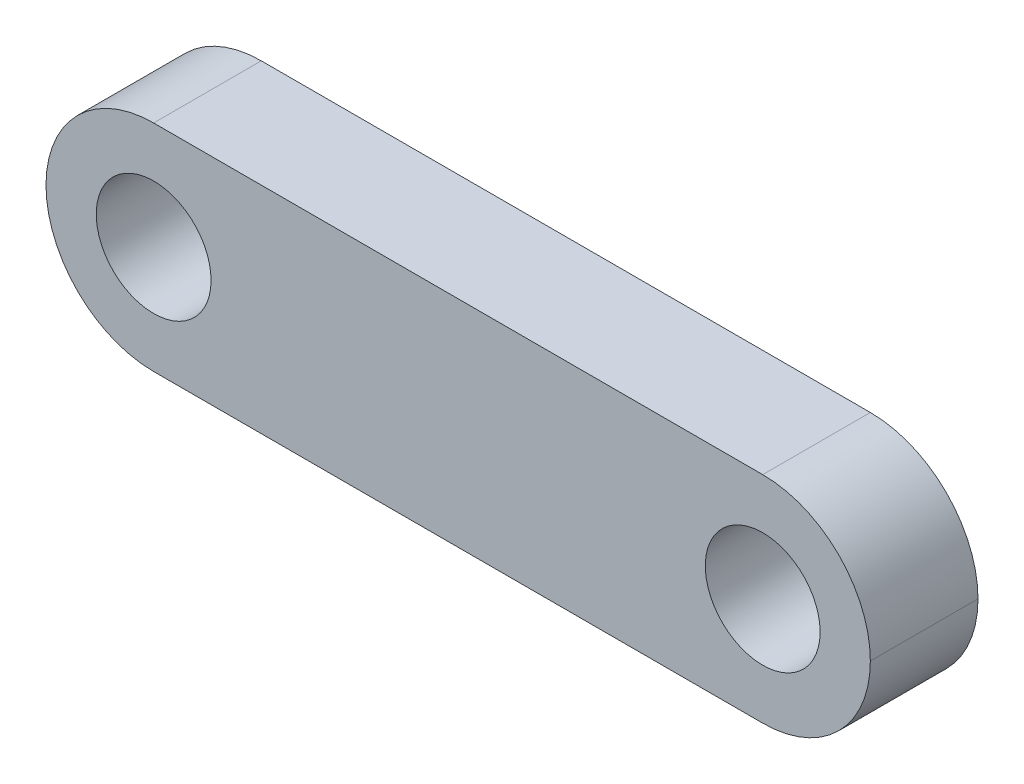
ISO-10303-21;
HEADER;
FILE_DESCRIPTION(('STEP AP214'),'2;1');
FILE_NAME('part.step','',(''),(''),'','','');
FILE_SCHEMA(('AUTOMOTIVE_DESIGN { 1 0 10303 214 1 1 1 1 }'));
ENDSEC;
DATA;
#1=APPLICATION_CONTEXT('core data for automotive mechanical design processes');
#2=APPLICATION_PROTOCOL_DEFINITION('international standard','automotive_design',2000,#1);
#3=PRODUCT_CONTEXT('',#1,'mechanical');
#4=PRODUCT('Part','Part','',(#3));
#5=PRODUCT_RELATED_PRODUCT_CATEGORY('part','',(#4));
#6=PRODUCT_DEFINITION_FORMATION('','',#4);
#7=PRODUCT_DEFINITION_CONTEXT('part definition',#1,'design');
#8=PRODUCT_DEFINITION('design','',#6,#7);
#9=PRODUCT_DEFINITION_SHAPE('','',#8);
#10=(LENGTH_UNIT() NAMED_UNIT(*) SI_UNIT(.MILLI.,.METRE.));
#11=(NAMED_UNIT(*) PLANE_ANGLE_UNIT() SI_UNIT($,.RADIAN.));
#12=(NAMED_UNIT(*) SI_UNIT($,.STERADIAN.) SOLID_ANGLE_UNIT());
#13=UNCERTAINTY_MEASURE_WITH_UNIT(LENGTH_MEASURE(1.E-05),#10,'distance_accuracy_value','');
#14=(GEOMETRIC_REPRESENTATION_CONTEXT(3) GLOBAL_UNCERTAINTY_ASSIGNED_CONTEXT((#13)) GLOBAL_UNIT_ASSIGNED_CONTEXT((#10,
#11,#12)) REPRESENTATION_CONTEXT('',''));
#15=CARTESIAN_POINT('',(0.,0.,0.));
#16=DIRECTION('',(0.,0.,1.));
#17=DIRECTION('',(1.,0.,0.));
#18=AXIS2_PLACEMENT_3D('',#15,#16,#17);
#19=CARTESIAN_POINT('',(7.77408782256623,3.,0.));
#20=DIRECTION('',(0.,0.,1.));
#21=DIRECTION('',(1.,0.,0.));
#22=AXIS2_PLACEMENT_3D('',#19,#20,#21);
#23=CYLINDRICAL_SURFACE('',#22,3.);
#24=CARTESIAN_POINT('',(7.77408782256623,3.,3.));
#25=DIRECTION('',(0.,0.,1.));
#26=DIRECTION('',(1.,0.,0.));
#27=AXIS2_PLACEMENT_3D('',#24,#25,#26);
#28=CIRCLE('',#27,3.);
#29=CARTESIAN_POINT('',(7.77408782256623,0.,3.));
#30=VERTEX_POINT('',#29);
#31=CARTESIAN_POINT('',(10.7740878225662,2.99999999999813,3.));
#32=VERTEX_POINT('',#31);
#33=EDGE_CURVE('E130',#30,#32,#28,.T.);
#34=ORIENTED_EDGE('',*,*,#33,.F.);
#35=DIRECTION('',(0.,0.,1.));
#36=VECTOR('',#35,1.);
#37=CARTESIAN_POINT('',(7.77408782256623,0.,0.));
#38=LINE('',#37,#36);
#39=CARTESIAN_POINT('',(7.77408782256623,0.,0.));
#40=VERTEX_POINT('',#39);
#41=EDGE_CURVE('E11',#40,#30,#38,.T.);
#42=ORIENTED_EDGE('',*,*,#41,.F.);
#43=CARTESIAN_POINT('',(7.77408782256623,3.,0.));
#44=DIRECTION('',(0.,0.,1.));
#45=DIRECTION('',(1.,0.,0.));
#46=AXIS2_PLACEMENT_3D('',#43,#44,#45);
#47=CIRCLE('',#46,3.);
#48=CARTESIAN_POINT('',(10.7740878225662,2.99999999999813,0.));
#49=VERTEX_POINT('',#48);
#50=EDGE_CURVE('E151',#40,#49,#47,.T.);
#51=ORIENTED_EDGE('',*,*,#50,.T.);
#52=DIRECTION('',(0.,0.,1.));
#53=VECTOR('',#52,1.);
#54=CARTESIAN_POINT('',(10.7740878225662,2.99999999999813,0.));
#55=LINE('',#54,#53);
#56=EDGE_CURVE('E42',#49,#32,#55,.T.);
#57=ORIENTED_EDGE('',*,*,#56,.T.);
#58=EDGE_LOOP('',(#34,#42,#51,#57));
#59=FACE_BOUND('',#58,.T.);
#60=ADVANCED_FACE('F39',(#59),#23,.T.);
#61=CARTESIAN_POINT('',(-9.20014533111081,0.,0.));
#62=DIRECTION('',(0.,-1.,0.));
#63=DIRECTION('',(0.,0.,-1.));
#64=AXIS2_PLACEMENT_3D('',#61,#62,#63);
#65=PLANE('',#64);
#66=DIRECTION('',(1.,0.,0.));
#67=VECTOR('',#66,1.);
#68=CARTESIAN_POINT('',(-9.20014533111081,0.,3.));
#69=LINE('',#68,#67);
#70=CARTESIAN_POINT('',(-9.20014533111081,0.,3.));
#71=VERTEX_POINT('',#70);
#72=EDGE_CURVE('E148',#71,#30,#69,.T.);
#73=ORIENTED_EDGE('',*,*,#72,.F.);
#74=DIRECTION('',(0.,0.,1.));
#75=VECTOR('',#74,1.);
#76=CARTESIAN_POINT('',(-9.20014533111081,0.,0.));
#77=LINE('',#76,#75);
#78=CARTESIAN_POINT('',(-9.20014533111081,0.,0.));
#79=VERTEX_POINT('',#78);
#80=EDGE_CURVE('E49',#79,#71,#77,.T.);
#81=ORIENTED_EDGE('',*,*,#80,.F.);
#82=DIRECTION('',(1.,0.,0.));
#83=VECTOR('',#82,1.);
#84=CARTESIAN_POINT('',(-9.20014533111081,0.,0.));
#85=LINE('',#84,#83);
#86=EDGE_CURVE('E116',#79,#40,#85,.T.);
#87=ORIENTED_EDGE('',*,*,#86,.T.);
#88=ORIENTED_EDGE('',*,*,#41,.T.);
#89=EDGE_LOOP('',(#73,#81,#87,#88));
#90=FACE_BOUND('',#89,.T.);
#91=ADVANCED_FACE('F163',(#90),#65,.T.);
#92=CARTESIAN_POINT('',(-9.20014533111081,3.,0.));
#93=DIRECTION('',(0.,0.,1.));
#94=DIRECTION('',(1.,0.,0.));
#95=AXIS2_PLACEMENT_3D('',#92,#93,#94);
#96=CYLINDRICAL_SURFACE('',#95,3.);
#97=CARTESIAN_POINT('',(-9.20014533111081,3.,3.));
#98=DIRECTION('',(0.,0.,1.));
#99=DIRECTION('',(1.,0.,0.));
#100=AXIS2_PLACEMENT_3D('',#97,#98,#99);
#101=CIRCLE('',#100,3.);
#102=CARTESIAN_POINT('',(-12.2001451644441,2.99899999999927,3.));
#103=VERTEX_POINT('',#102);
#104=EDGE_CURVE('E102',#103,#71,#101,.T.);
#105=ORIENTED_EDGE('',*,*,#104,.F.);
#106=DIRECTION('',(0.,0.,1.));
#107=VECTOR('',#106,1.);
#108=CARTESIAN_POINT('',(-12.2001451644441,2.99899999999927,0.));
#109=LINE('',#108,#107);
#110=CARTESIAN_POINT('',(-12.2001451644441,2.99899999999927,0.));
#111=VERTEX_POINT('',#110);
#112=EDGE_CURVE('E97',#111,#103,#109,.T.);
#113=ORIENTED_EDGE('',*,*,#112,.F.);
#114=CARTESIAN_POINT('',(-9.20014533111081,3.,0.));
#115=DIRECTION('',(0.,0.,1.));
#116=DIRECTION('',(1.,0.,0.));
#117=AXIS2_PLACEMENT_3D('',#114,#115,#116);
#118=CIRCLE('',#117,3.);
#119=EDGE_CURVE('E100',#111,#79,#118,.T.);
#120=ORIENTED_EDGE('',*,*,#119,.T.);
#121=ORIENTED_EDGE('',*,*,#80,.T.);
#122=EDGE_LOOP('',(#105,#113,#120,#121));
#123=FACE_BOUND('',#122,.T.);
#124=ADVANCED_FACE('F99',(#123),#96,.T.);
#125=CARTESIAN_POINT('',(-9.20014516444414,2.999,0.));
#126=DIRECTION('',(0.,0.,1.));
#127=DIRECTION('',(1.,0.,0.));
#128=AXIS2_PLACEMENT_3D('',#125,#126,#127);
#129=CYLINDRICAL_SURFACE('',#128,3.);
#130=CARTESIAN_POINT('',(-9.20014516444414,2.999,3.));
#131=DIRECTION('',(0.,0.,1.));
#132=DIRECTION('',(1.,0.,0.));
#133=AXIS2_PLACEMENT_3D('',#130,#131,#132);
#134=CIRCLE('',#133,3.);
#135=CARTESIAN_POINT('',(-9.20014516444414,5.999,3.));
#136=VERTEX_POINT('',#135);
#137=EDGE_CURVE('E143',#136,#103,#134,.T.);
#138=ORIENTED_EDGE('',*,*,#137,.F.);
#139=DIRECTION('',(0.,0.,1.));
#140=VECTOR('',#139,1.);
#141=CARTESIAN_POINT('',(-9.20014516444414,5.999,0.));
#142=LINE('',#141,#140);
#143=CARTESIAN_POINT('',(-9.20014516444414,5.999,0.));
#144=VERTEX_POINT('',#143);
#145=EDGE_CURVE('E108',#144,#136,#142,.T.);
#146=ORIENTED_EDGE('',*,*,#145,.F.);
#147=CARTESIAN_POINT('',(-9.20014516444414,2.999,0.));
#148=DIRECTION('',(0.,0.,1.));
#149=DIRECTION('',(1.,0.,0.));
#150=AXIS2_PLACEMENT_3D('',#147,#148,#149);
#151=CIRCLE('',#150,3.);
#152=EDGE_CURVE('E114',#144,#111,#151,.T.);
#153=ORIENTED_EDGE('',*,*,#152,.T.);
#154=ORIENTED_EDGE('',*,*,#112,.T.);
#155=EDGE_LOOP('',(#138,#146,#153,#154));
#156=FACE_BOUND('',#155,.T.);
#157=ADVANCED_FACE('F119',(#156),#129,.T.);
#158=CARTESIAN_POINT('',(7.7740879892329,5.999,0.));
#159=DIRECTION('',(0.,1.,0.));
#160=DIRECTION('',(-1.,0.,0.));
#161=AXIS2_PLACEMENT_3D('',#158,#159,#160);
#162=PLANE('',#161);
#163=DIRECTION('',(-1.,0.,0.));
#164=VECTOR('',#163,1.);
#165=CARTESIAN_POINT('',(7.7740879892329,5.999,3.));
#166=LINE('',#165,#164);
#167=CARTESIAN_POINT('',(7.7740879892329,5.999,3.));
#168=VERTEX_POINT('',#167);
#169=EDGE_CURVE('E139',#168,#136,#166,.T.);
#170=ORIENTED_EDGE('',*,*,#169,.F.);
#171=DIRECTION('',(0.,0.,1.));
#172=VECTOR('',#171,1.);
#173=CARTESIAN_POINT('',(7.7740879892329,5.999,0.));
#174=LINE('',#173,#172);
#175=CARTESIAN_POINT('',(7.7740879892329,5.999,0.));
#176=VERTEX_POINT('',#175);
#177=EDGE_CURVE('E156',#176,#168,#174,.T.);
#178=ORIENTED_EDGE('',*,*,#177,.F.);
#179=DIRECTION('',(-1.,0.,0.));
#180=VECTOR('',#179,1.);
#181=CARTESIAN_POINT('',(7.7740879892329,5.999,0.));
#182=LINE('',#181,#180);
#183=EDGE_CURVE('E121',#176,#144,#182,.T.);
#184=ORIENTED_EDGE('',*,*,#183,.T.);
#185=ORIENTED_EDGE('',*,*,#145,.T.);
#186=EDGE_LOOP('',(#170,#178,#184,#185));
#187=FACE_BOUND('',#186,.T.);
#188=ADVANCED_FACE('F176',(#187),#162,.T.);
#189=CARTESIAN_POINT('',(7.7740879892329,2.999,0.));
#190=DIRECTION('',(0.,0.,1.));
#191=DIRECTION('',(1.,0.,0.));
#192=AXIS2_PLACEMENT_3D('',#189,#190,#191);
#193=CYLINDRICAL_SURFACE('',#192,3.);
#194=CARTESIAN_POINT('',(7.7740879892329,2.999,3.));
#195=DIRECTION('',(0.,0.,1.));
#196=DIRECTION('',(1.,0.,0.));
#197=AXIS2_PLACEMENT_3D('',#194,#195,#196);
#198=CIRCLE('',#197,3.);
#199=EDGE_CURVE('E134',#32,#168,#198,.T.);
#200=ORIENTED_EDGE('',*,*,#199,.F.);
#201=ORIENTED_EDGE('',*,*,#56,.F.);
#202=CARTESIAN_POINT('',(7.7740879892329,2.999,0.));
#203=DIRECTION('',(0.,0.,1.));
#204=DIRECTION('',(1.,0.,0.));
#205=AXIS2_PLACEMENT_3D('',#202,#203,#204);
#206=CIRCLE('',#205,3.);
#207=EDGE_CURVE('E124',#49,#176,#206,.T.);
#208=ORIENTED_EDGE('',*,*,#207,.T.);
#209=ORIENTED_EDGE('',*,*,#177,.T.);
#210=EDGE_LOOP('',(#200,#201,#208,#209));
#211=FACE_BOUND('',#210,.T.);
#212=ADVANCED_FACE('F160',(#211),#193,.T.);
#213=CARTESIAN_POINT('',(7.77408782256623,3.,0.));
#214=DIRECTION('',(0.,0.,1.));
#215=DIRECTION('',(1.,0.,0.));
#216=AXIS2_PLACEMENT_3D('',#213,#214,#215);
#217=PLANE('',#216);
#218=CARTESIAN_POINT('',(-9.20014533111081,3.,0.));
#219=DIRECTION('',(0.,0.,1.));
#220=DIRECTION('',(1.,0.,0.));
#221=AXIS2_PLACEMENT_3D('',#218,#219,#220);
#222=CIRCLE('',#221,1.6);
#223=CARTESIAN_POINT('',(-7.60014533111081,3.,0.));
#224=VERTEX_POINT('',#223);
#225=EDGE_CURVE('E135',#224,#224,#222,.T.);
#226=ORIENTED_EDGE('',*,*,#225,.T.);
#227=EDGE_LOOP('',(#226));
#228=FACE_BOUND('',#227,.T.);
#229=CARTESIAN_POINT('',(7.7740879892329,2.999,0.));
#230=DIRECTION('',(0.,0.,1.));
#231=DIRECTION('',(1.,0.,0.));
#232=AXIS2_PLACEMENT_3D('',#229,#230,#231);
#233=CIRCLE('',#232,1.6);
#234=CARTESIAN_POINT('',(9.3740879892329,2.999,0.));
#235=VERTEX_POINT('',#234);
#236=EDGE_CURVE('E206',#235,#235,#233,.T.);
#237=ORIENTED_EDGE('',*,*,#236,.T.);
#238=EDGE_LOOP('',(#237));
#239=FACE_BOUND('',#238,.T.);
#240=ORIENTED_EDGE('',*,*,#50,.F.);
#241=ORIENTED_EDGE('',*,*,#86,.F.);
#242=ORIENTED_EDGE('',*,*,#119,.F.);
#243=ORIENTED_EDGE('',*,*,#152,.F.);
#244=ORIENTED_EDGE('',*,*,#183,.F.);
#245=ORIENTED_EDGE('',*,*,#207,.F.);
#246=EDGE_LOOP('',(#240,#241,#242,#243,#244,#245));
#247=FACE_BOUND('',#246,.T.);
#248=ADVANCED_FACE('F112',(#228,#239,#247),#217,.F.);
#249=CARTESIAN_POINT('',(7.77408782256623,3.,3.));
#250=DIRECTION('',(0.,0.,1.));
#251=DIRECTION('',(1.,0.,0.));
#252=AXIS2_PLACEMENT_3D('',#249,#250,#251);
#253=PLANE('',#252);
#254=CARTESIAN_POINT('',(-9.20014533111081,3.,3.));
#255=DIRECTION('',(0.,0.,1.));
#256=DIRECTION('',(1.,0.,0.));
#257=AXIS2_PLACEMENT_3D('',#254,#255,#256);
#258=CIRCLE('',#257,1.6);
#259=CARTESIAN_POINT('',(-7.60014533111081,3.,3.));
#260=VERTEX_POINT('',#259);
#261=EDGE_CURVE('E204',#260,#260,#258,.T.);
#262=ORIENTED_EDGE('',*,*,#261,.F.);
#263=EDGE_LOOP('',(#262));
#264=FACE_BOUND('',#263,.T.);
#265=CARTESIAN_POINT('',(7.7740879892329,2.999,3.));
#266=DIRECTION('',(0.,0.,1.));
#267=DIRECTION('',(1.,0.,0.));
#268=AXIS2_PLACEMENT_3D('',#265,#266,#267);
#269=CIRCLE('',#268,1.6);
#270=CARTESIAN_POINT('',(9.3740879892329,2.999,3.));
#271=VERTEX_POINT('',#270);
#272=EDGE_CURVE('E212',#271,#271,#269,.T.);
#273=ORIENTED_EDGE('',*,*,#272,.F.);
#274=EDGE_LOOP('',(#273));
#275=FACE_BOUND('',#274,.T.);
#276=ORIENTED_EDGE('',*,*,#33,.T.);
#277=ORIENTED_EDGE('',*,*,#199,.T.);
#278=ORIENTED_EDGE('',*,*,#169,.T.);
#279=ORIENTED_EDGE('',*,*,#137,.T.);
#280=ORIENTED_EDGE('',*,*,#104,.T.);
#281=ORIENTED_EDGE('',*,*,#72,.T.);
#282=EDGE_LOOP('',(#276,#277,#278,#279,#280,#281));
#283=FACE_BOUND('',#282,.T.);
#284=ADVANCED_FACE('F162',(#264,#275,#283),#253,.T.);
#285=CARTESIAN_POINT('',(7.7740879892329,2.999,0.));
#286=DIRECTION('',(0.,0.,1.));
#287=DIRECTION('',(1.,0.,0.));
#288=AXIS2_PLACEMENT_3D('',#285,#286,#287);
#289=CYLINDRICAL_SURFACE('',#288,1.6);
#290=CARTESIAN_POINT('',(9.3740879892329,2.999,0.));
#291=CARTESIAN_POINT('',(9.3740879892329,2.999,0.0312499999999995));
#292=CARTESIAN_POINT('',(9.3740879892329,2.999,0.0624999999999996));
#293=CARTESIAN_POINT('',(9.3740879892329,2.999,0.125));
#294=CARTESIAN_POINT('',(9.3740879892329,2.999,0.15625));
#295=CARTESIAN_POINT('',(9.3740879892329,2.999,0.21875));
#296=CARTESIAN_POINT('',(9.3740879892329,2.999,0.25));
#297=CARTESIAN_POINT('',(9.3740879892329,2.999,0.3125));
#298=CARTESIAN_POINT('',(9.3740879892329,2.999,0.34375));
#299=CARTESIAN_POINT('',(9.3740879892329,2.999,0.40625));
#300=CARTESIAN_POINT('',(9.3740879892329,2.999,0.4375));
#301=CARTESIAN_POINT('',(9.3740879892329,2.999,0.5));
#302=CARTESIAN_POINT('',(9.3740879892329,2.999,0.53125));
#303=CARTESIAN_POINT('',(9.3740879892329,2.999,0.59375));
#304=CARTESIAN_POINT('',(9.3740879892329,2.999,0.625));
#305=CARTESIAN_POINT('',(9.3740879892329,2.999,0.6875));
#306=CARTESIAN_POINT('',(9.3740879892329,2.999,0.71875));
#307=CARTESIAN_POINT('',(9.3740879892329,2.999,0.78125));
#308=CARTESIAN_POINT('',(9.3740879892329,2.999,0.8125));
#309=CARTESIAN_POINT('',(9.3740879892329,2.999,0.875));
#310=CARTESIAN_POINT('',(9.3740879892329,2.999,0.90625));
#311=CARTESIAN_POINT('',(9.3740879892329,2.999,0.96875));
#312=CARTESIAN_POINT('',(9.3740879892329,2.999,1.));
#313=CARTESIAN_POINT('',(9.3740879892329,2.999,1.0625));
#314=CARTESIAN_POINT('',(9.3740879892329,2.999,1.09375));
#315=CARTESIAN_POINT('',(9.3740879892329,2.999,1.15625));
#316=CARTESIAN_POINT('',(9.3740879892329,2.999,1.1875));
#317=CARTESIAN_POINT('',(9.3740879892329,2.999,1.25));
#318=CARTESIAN_POINT('',(9.3740879892329,2.999,1.28125));
#319=CARTESIAN_POINT('',(9.3740879892329,2.999,1.34375));
#320=CARTESIAN_POINT('',(9.3740879892329,2.999,1.375));
#321=CARTESIAN_POINT('',(9.3740879892329,2.999,1.4375));
#322=CARTESIAN_POINT('',(9.3740879892329,2.999,1.46875));
#323=CARTESIAN_POINT('',(9.3740879892329,2.999,1.53125));
#324=CARTESIAN_POINT('',(9.3740879892329,2.999,1.5625));
#325=CARTESIAN_POINT('',(9.3740879892329,2.999,1.625));
#326=CARTESIAN_POINT('',(9.3740879892329,2.999,1.65625));
#327=CARTESIAN_POINT('',(9.3740879892329,2.999,1.71875));
#328=CARTESIAN_POINT('',(9.3740879892329,2.999,1.75));
#329=CARTESIAN_POINT('',(9.3740879892329,2.999,1.8125));
#330=CARTESIAN_POINT('',(9.3740879892329,2.999,1.84375));
#331=CARTESIAN_POINT('',(9.3740879892329,2.999,1.90625));
#332=CARTESIAN_POINT('',(9.3740879892329,2.999,1.9375));
#333=CARTESIAN_POINT('',(9.3740879892329,2.999,2.));
#334=CARTESIAN_POINT('',(9.3740879892329,2.999,2.03125));
#335=CARTESIAN_POINT('',(9.3740879892329,2.999,2.09375));
#336=CARTESIAN_POINT('',(9.3740879892329,2.999,2.125));
#337=CARTESIAN_POINT('',(9.3740879892329,2.999,2.1875));
#338=CARTESIAN_POINT('',(9.3740879892329,2.999,2.21875));
#339=CARTESIAN_POINT('',(9.3740879892329,2.999,2.28125));
#340=CARTESIAN_POINT('',(9.3740879892329,2.999,2.3125));
#341=CARTESIAN_POINT('',(9.3740879892329,2.999,2.375));
#342=CARTESIAN_POINT('',(9.3740879892329,2.999,2.40625));
#343=CARTESIAN_POINT('',(9.3740879892329,2.999,2.46875));
#344=CARTESIAN_POINT('',(9.3740879892329,2.999,2.5));
#345=CARTESIAN_POINT('',(9.3740879892329,2.999,2.5625));
#346=CARTESIAN_POINT('',(9.3740879892329,2.999,2.59375));
#347=CARTESIAN_POINT('',(9.3740879892329,2.999,2.65625));
#348=CARTESIAN_POINT('',(9.3740879892329,2.999,2.6875));
#349=CARTESIAN_POINT('',(9.3740879892329,2.999,2.75));
#350=CARTESIAN_POINT('',(9.3740879892329,2.999,2.78125));
#351=CARTESIAN_POINT('',(9.3740879892329,2.999,2.84375));
#352=CARTESIAN_POINT('',(9.3740879892329,2.999,2.875));
#353=CARTESIAN_POINT('',(9.3740879892329,2.999,2.9375));
#354=CARTESIAN_POINT('',(9.3740879892329,2.999,2.96875));
#355=CARTESIAN_POINT('',(9.3740879892329,2.999,3.));
#356=B_SPLINE_CURVE_WITH_KNOTS('',3,(#290,#291,#292,#293,#294,#295,#296,#297,#298,#299,#300,
#301,#302,#303,#304,#305,#306,#307,#308,#309,#310,#311,#312,#313,#314,#315,#316,#317,#318,#319,
#320,#321,#322,#323,#324,#325,#326,#327,#328,#329,#330,#331,#332,#333,#334,#335,#336,#337,#338,
#339,#340,#341,#342,#343,#344,#345,#346,#347,#348,#349,#350,#351,#352,#353,#354,#355),
.UNSPECIFIED.,.F.,.F.,(4,2,2,2,2,2,2,2,2,2,2,2,2,2,2,2,2,2,2,2,2,2,2,2,2,2,2,2,2,2,2,2,4),(0.,
0.09375,0.1875,0.28125,0.375,0.46875,0.5625,0.65625,0.75,0.84375,0.9375,1.03125,1.125,1.21875,
1.3125,1.40625,1.5,1.59375,1.6875,1.78125,1.875,1.96875,2.0625,2.15625,2.25,2.34375,2.4375,
2.53125,2.625,2.71875,2.8125,2.90625,3.),.UNSPECIFIED.);
#357=EDGE_CURVE('BSEAM187',#235,#271,#356,.T.);
#358=ORIENTED_EDGE('',*,*,#236,.F.);
#359=ORIENTED_EDGE('',*,*,#272,.T.);
#360=ORIENTED_EDGE('',*,*,#357,.T.);
#361=ORIENTED_EDGE('',*,*,#357,.F.);
#362=EDGE_LOOP('',(#358,#360,#359,#361));
#363=FACE_BOUND('',#362,.T.);
#364=ADVANCED_FACE('F187',(#363),#289,.F.);
#365=CARTESIAN_POINT('',(-9.20014533111081,3.,0.));
#366=DIRECTION('',(0.,0.,1.));
#367=DIRECTION('',(1.,0.,0.));
#368=AXIS2_PLACEMENT_3D('',#365,#366,#367);
#369=CYLINDRICAL_SURFACE('',#368,1.6);
#370=CARTESIAN_POINT('',(-7.60014533111081,3.,0.));
#371=CARTESIAN_POINT('',(-7.60014533111081,3.,0.0312499999999995));
#372=CARTESIAN_POINT('',(-7.60014533111081,3.,0.0624999999999996));
#373=CARTESIAN_POINT('',(-7.60014533111081,3.,0.125));
#374=CARTESIAN_POINT('',(-7.60014533111081,3.,0.15625));
#375=CARTESIAN_POINT('',(-7.60014533111081,3.,0.21875));
#376=CARTESIAN_POINT('',(-7.60014533111081,3.,0.25));
#377=CARTESIAN_POINT('',(-7.60014533111081,3.,0.3125));
#378=CARTESIAN_POINT('',(-7.60014533111081,3.,0.34375));
#379=CARTESIAN_POINT('',(-7.60014533111081,3.,0.40625));
#380=CARTESIAN_POINT('',(-7.60014533111081,3.,0.4375));
#381=CARTESIAN_POINT('',(-7.60014533111081,3.,0.5));
#382=CARTESIAN_POINT('',(-7.60014533111081,3.,0.53125));
#383=CARTESIAN_POINT('',(-7.60014533111081,3.,0.59375));
#384=CARTESIAN_POINT('',(-7.60014533111081,3.,0.625));
#385=CARTESIAN_POINT('',(-7.60014533111081,3.,0.6875));
#386=CARTESIAN_POINT('',(-7.60014533111081,3.,0.71875));
#387=CARTESIAN_POINT('',(-7.60014533111081,3.,0.78125));
#388=CARTESIAN_POINT('',(-7.60014533111081,3.,0.8125));
#389=CARTESIAN_POINT('',(-7.60014533111081,3.,0.875));
#390=CARTESIAN_POINT('',(-7.60014533111081,3.,0.90625));
#391=CARTESIAN_POINT('',(-7.60014533111081,3.,0.96875));
#392=CARTESIAN_POINT('',(-7.60014533111081,3.,1.));
#393=CARTESIAN_POINT('',(-7.60014533111081,3.,1.0625));
#394=CARTESIAN_POINT('',(-7.60014533111081,3.,1.09375));
#395=CARTESIAN_POINT('',(-7.60014533111081,3.,1.15625));
#396=CARTESIAN_POINT('',(-7.60014533111081,3.,1.1875));
#397=CARTESIAN_POINT('',(-7.60014533111081,3.,1.25));
#398=CARTESIAN_POINT('',(-7.60014533111081,3.,1.28125));
#399=CARTESIAN_POINT('',(-7.60014533111081,3.,1.34375));
#400=CARTESIAN_POINT('',(-7.60014533111081,3.,1.375));
#401=CARTESIAN_POINT('',(-7.60014533111081,3.,1.4375));
#402=CARTESIAN_POINT('',(-7.60014533111081,3.,1.46875));
#403=CARTESIAN_POINT('',(-7.60014533111081,3.,1.53125));
#404=CARTESIAN_POINT('',(-7.60014533111081,3.,1.5625));
#405=CARTESIAN_POINT('',(-7.60014533111081,3.,1.625));
#406=CARTESIAN_POINT('',(-7.60014533111081,3.,1.65625));
#407=CARTESIAN_POINT('',(-7.60014533111081,3.,1.71875));
#408=CARTESIAN_POINT('',(-7.60014533111081,3.,1.75));
#409=CARTESIAN_POINT('',(-7.60014533111081,3.,1.8125));
#410=CARTESIAN_POINT('',(-7.60014533111081,3.,1.84375));
#411=CARTESIAN_POINT('',(-7.60014533111081,3.,1.90625));
#412=CARTESIAN_POINT('',(-7.60014533111081,3.,1.9375));
#413=CARTESIAN_POINT('',(-7.60014533111081,3.,2.));
#414=CARTESIAN_POINT('',(-7.60014533111081,3.,2.03125));
#415=CARTESIAN_POINT('',(-7.60014533111081,3.,2.09375));
#416=CARTESIAN_POINT('',(-7.60014533111081,3.,2.125));
#417=CARTESIAN_POINT('',(-7.60014533111081,3.,2.1875));
#418=CARTESIAN_POINT('',(-7.60014533111081,3.,2.21875));
#419=CARTESIAN_POINT('',(-7.60014533111081,3.,2.28125));
#420=CARTESIAN_POINT('',(-7.60014533111081,3.,2.3125));
#421=CARTESIAN_POINT('',(-7.60014533111081,3.,2.375));
#422=CARTESIAN_POINT('',(-7.60014533111081,3.,2.40625));
#423=CARTESIAN_POINT('',(-7.60014533111081,3.,2.46875));
#424=CARTESIAN_POINT('',(-7.60014533111081,3.,2.5));
#425=CARTESIAN_POINT('',(-7.60014533111081,3.,2.5625));
#426=CARTESIAN_POINT('',(-7.60014533111081,3.,2.59375));
#427=CARTESIAN_POINT('',(-7.60014533111081,3.,2.65625));
#428=CARTESIAN_POINT('',(-7.60014533111081,3.,2.6875));
#429=CARTESIAN_POINT('',(-7.60014533111081,3.,2.75));
#430=CARTESIAN_POINT('',(-7.60014533111081,3.,2.78125));
#431=CARTESIAN_POINT('',(-7.60014533111081,3.,2.84375));
#432=CARTESIAN_POINT('',(-7.60014533111081,3.,2.875));
#433=CARTESIAN_POINT('',(-7.60014533111081,3.,2.9375));
#434=CARTESIAN_POINT('',(-7.60014533111081,3.,2.96875));
#435=CARTESIAN_POINT('',(-7.60014533111081,3.,3.));
#436=B_SPLINE_CURVE_WITH_KNOTS('',3,(#370,#371,#372,#373,#374,#375,#376,#377,#378,#379,#380,
#381,#382,#383,#384,#385,#386,#387,#388,#389,#390,#391,#392,#393,#394,#395,#396,#397,#398,#399,
#400,#401,#402,#403,#404,#405,#406,#407,#408,#409,#410,#411,#412,#413,#414,#415,#416,#417,#418,
#419,#420,#421,#422,#423,#424,#425,#426,#427,#428,#429,#430,#431,#432,#433,#434,#435),
.UNSPECIFIED.,.F.,.F.,(4,2,2,2,2,2,2,2,2,2,2,2,2,2,2,2,2,2,2,2,2,2,2,2,2,2,2,2,2,2,2,2,4),(0.,
0.09375,0.1875,0.28125,0.375,0.46875,0.5625,0.65625,0.75,0.84375,0.9375,1.03125,1.125,1.21875,
1.3125,1.40625,1.5,1.59375,1.6875,1.78125,1.875,1.96875,2.0625,2.15625,2.25,2.34375,2.4375,
2.53125,2.625,2.71875,2.8125,2.90625,3.),.UNSPECIFIED.);
#437=EDGE_CURVE('BSEAM194',#224,#260,#436,.T.);
#438=ORIENTED_EDGE('',*,*,#225,.F.);
#439=ORIENTED_EDGE('',*,*,#261,.T.);
#440=ORIENTED_EDGE('',*,*,#437,.T.);
#441=ORIENTED_EDGE('',*,*,#437,.F.);
#442=EDGE_LOOP('',(#438,#440,#439,#441));
#443=FACE_BOUND('',#442,.T.);
#444=ADVANCED_FACE('F194',(#443),#369,.F.);
#445=CLOSED_SHELL('',(#60,#91,#124,#157,#188,#212,#248,#284,#364,#444));
#446=MANIFOLD_SOLID_BREP('B2',#445);
#447=ADVANCED_BREP_SHAPE_REPRESENTATION('',(#18,#446),#14);
#448=SHAPE_DEFINITION_REPRESENTATION(#9,#447);
ENDSEC;
END-ISO-10303-21;
